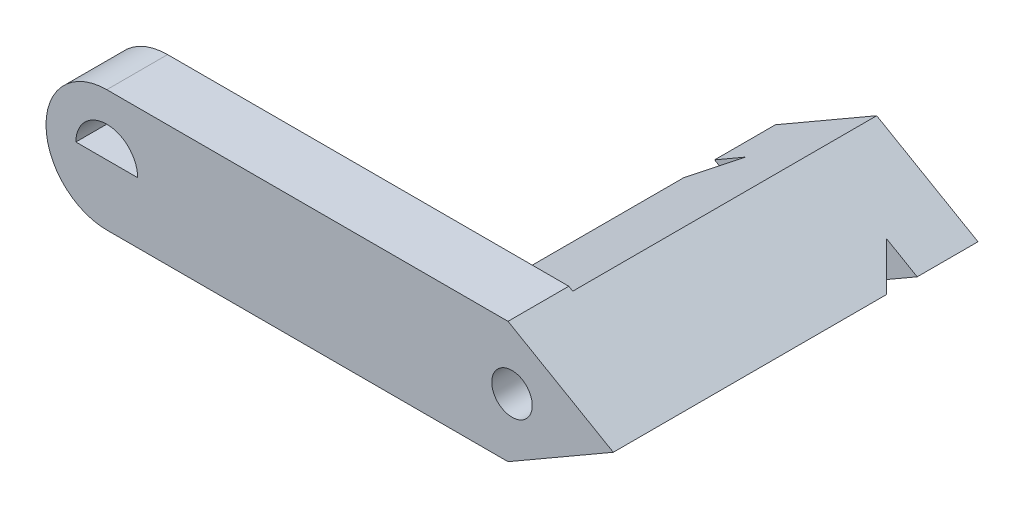
ISO-10303-21;
HEADER;
FILE_DESCRIPTION(('STEP AP214'),'2;1');
FILE_NAME('part.step','',(''),(''),'','','');
FILE_SCHEMA(('AUTOMOTIVE_DESIGN { 1 0 10303 214 1 1 1 1 }'));
ENDSEC;
DATA;
#1=APPLICATION_CONTEXT('core data for automotive mechanical design processes');
#2=APPLICATION_PROTOCOL_DEFINITION('international standard','automotive_design',2000,#1);
#3=PRODUCT_CONTEXT('',#1,'mechanical');
#4=PRODUCT('Part','Part','',(#3));
#5=PRODUCT_RELATED_PRODUCT_CATEGORY('part','',(#4));
#6=PRODUCT_DEFINITION_FORMATION('','',#4);
#7=PRODUCT_DEFINITION_CONTEXT('part definition',#1,'design');
#8=PRODUCT_DEFINITION('design','',#6,#7);
#9=PRODUCT_DEFINITION_SHAPE('','',#8);
#10=(LENGTH_UNIT() NAMED_UNIT(*) SI_UNIT(.MILLI.,.METRE.));
#11=(NAMED_UNIT(*) PLANE_ANGLE_UNIT() SI_UNIT($,.RADIAN.));
#12=(NAMED_UNIT(*) SI_UNIT($,.STERADIAN.) SOLID_ANGLE_UNIT());
#13=UNCERTAINTY_MEASURE_WITH_UNIT(LENGTH_MEASURE(1.E-05),#10,'distance_accuracy_value','');
#14=(GEOMETRIC_REPRESENTATION_CONTEXT(3) GLOBAL_UNCERTAINTY_ASSIGNED_CONTEXT((#13)) GLOBAL_UNIT_ASSIGNED_CONTEXT((#10,
#11,#12)) REPRESENTATION_CONTEXT('',''));
#15=CARTESIAN_POINT('',(0.,0.,0.));
#16=DIRECTION('',(0.,0.,1.));
#17=DIRECTION('',(1.,0.,0.));
#18=AXIS2_PLACEMENT_3D('',#15,#16,#17);
#19=CARTESIAN_POINT('',(0.,0.,-30.));
#20=DIRECTION('',(0.,0.,1.));
#21=DIRECTION('',(1.,0.,0.));
#22=AXIS2_PLACEMENT_3D('',#19,#20,#21);
#23=PLANE('',#22);
#24=DIRECTION('',(-0.866025403784441,0.499999999999997,0.));
#25=VECTOR('',#24,1.);
#26=CARTESIAN_POINT('',(14.6076951545865,0.,-30.));
#27=LINE('',#26,#25);
#28=CARTESIAN_POINT('',(14.9999999999999,-0.226497308103804,-30.));
#29=VERTEX_POINT('',#28);
#30=CARTESIAN_POINT('',(25.,-6.00000000000007,-30.));
#31=VERTEX_POINT('',#30);
#32=EDGE_CURVE('E318',#29,#31,#27,.F.);
#33=ORIENTED_EDGE('',*,*,#32,.T.);
#34=DIRECTION('',(0.866025403784441,0.499999999999997,0.));
#35=VECTOR('',#34,1.);
#36=CARTESIAN_POINT('',(25.,-5.99999999999992,-30.));
#37=LINE('',#36,#35);
#38=CARTESIAN_POINT('',(14.9999999999999,-11.7735026918962,-30.));
#39=VERTEX_POINT('',#38);
#40=EDGE_CURVE('E320',#31,#39,#37,.F.);
#41=ORIENTED_EDGE('',*,*,#40,.T.);
#42=DIRECTION('',(0.866025403784438,-0.500000000000001,0.));
#43=VECTOR('',#42,1.);
#44=CARTESIAN_POINT('',(5.,-5.99999999999998,-30.));
#45=LINE('',#44,#43);
#46=CARTESIAN_POINT('',(5.,-6.00000000000001,-30.));
#47=VERTEX_POINT('',#46);
#48=EDGE_CURVE('E296',#39,#47,#45,.F.);
#49=ORIENTED_EDGE('',*,*,#48,.T.);
#50=DIRECTION('',(-0.866025403784438,-0.500000000000001,0.));
#51=VECTOR('',#50,1.);
#52=CARTESIAN_POINT('',(15.3923048454133,0.,-30.));
#53=LINE('',#52,#51);
#54=EDGE_CURVE('E293',#47,#29,#53,.F.);
#55=ORIENTED_EDGE('',*,*,#54,.T.);
#56=EDGE_LOOP('',(#33,#41,#49,#55));
#57=FACE_BOUND('',#56,.T.);
#58=DIRECTION('',(-0.866025403784439,-0.499999999999999,0.));
#59=VECTOR('',#58,1.);
#60=CARTESIAN_POINT('',(15.,-1.84307806183469,-30.));
#61=LINE('',#60,#59);
#62=CARTESIAN_POINT('',(15.,-1.84307806183469,-30.));
#63=VERTEX_POINT('',#62);
#64=CARTESIAN_POINT('',(11.4,-3.92153903091735,-30.));
#65=VERTEX_POINT('',#64);
#66=EDGE_CURVE('E57',#63,#65,#61,.T.);
#67=ORIENTED_EDGE('',*,*,#66,.T.);
#68=DIRECTION('',(0.,-1.,0.));
#69=VECTOR('',#68,1.);
#70=CARTESIAN_POINT('',(11.4,-3.92153903091735,-30.));
#71=LINE('',#70,#69);
#72=CARTESIAN_POINT('',(11.4,-8.07846096908265,-30.));
#73=VERTEX_POINT('',#72);
#74=EDGE_CURVE('E217',#65,#73,#71,.T.);
#75=ORIENTED_EDGE('',*,*,#74,.T.);
#76=DIRECTION('',(0.866025403784439,-0.499999999999998,0.));
#77=VECTOR('',#76,1.);
#78=CARTESIAN_POINT('',(11.4,-8.07846096908265,-30.));
#79=LINE('',#78,#77);
#80=CARTESIAN_POINT('',(15.,-10.1569219381653,-30.));
#81=VERTEX_POINT('',#80);
#82=EDGE_CURVE('E599',#73,#81,#79,.T.);
#83=ORIENTED_EDGE('',*,*,#82,.T.);
#84=DIRECTION('',(0.866025403784438,0.500000000000001,0.));
#85=VECTOR('',#84,1.);
#86=CARTESIAN_POINT('',(15.,-10.1569219381653,-30.));
#87=LINE('',#86,#85);
#88=CARTESIAN_POINT('',(18.6,-8.07846096908265,-30.));
#89=VERTEX_POINT('',#88);
#90=EDGE_CURVE('E596',#81,#89,#87,.T.);
#91=ORIENTED_EDGE('',*,*,#90,.T.);
#92=DIRECTION('',(0.,1.,0.));
#93=VECTOR('',#92,1.);
#94=CARTESIAN_POINT('',(18.6,-8.07846096908265,-30.));
#95=LINE('',#94,#93);
#96=CARTESIAN_POINT('',(18.6,-3.92153903091734,-30.));
#97=VERTEX_POINT('',#96);
#98=EDGE_CURVE('E590',#89,#97,#95,.T.);
#99=ORIENTED_EDGE('',*,*,#98,.T.);
#100=DIRECTION('',(-0.866025403784439,0.5,0.));
#101=VECTOR('',#100,1.);
#102=CARTESIAN_POINT('',(18.6,-3.92153903091734,-30.));
#103=LINE('',#102,#101);
#104=EDGE_CURVE('E213',#97,#63,#103,.T.);
#105=ORIENTED_EDGE('',*,*,#104,.T.);
#106=EDGE_LOOP('',(#67,#75,#83,#91,#99,#105));
#107=FACE_BOUND('',#106,.T.);
#108=ADVANCED_FACE('F40',(#57,#107),#23,.F.);
#109=CARTESIAN_POINT('',(25.001,-7.75,-24.));
#110=DIRECTION('',(0.,-0.866025403784437,0.500000000000003));
#111=DIRECTION('',(0.,-0.500000000000003,-0.866025403784437));
#112=AXIS2_PLACEMENT_3D('',#109,#110,#111);
#113=PLANE('',#112);
#114=DIRECTION('',(-1.,0.,0.));
#115=VECTOR('',#114,1.);
#116=CARTESIAN_POINT('',(25.001,-7.75,-24.));
#117=LINE('',#116,#115);
#118=CARTESIAN_POINT('',(14.0317541634481,-7.75,-24.));
#119=VERTEX_POINT('',#118);
#120=CARTESIAN_POINT('',(8.03108891324555,-7.75,-24.));
#121=VERTEX_POINT('',#120);
#122=EDGE_CURVE('E241',#119,#121,#117,.T.);
#123=ORIENTED_EDGE('',*,*,#122,.T.);
#124=DIRECTION('',(0.654653670707979,-0.377964473009229,-0.654653670707974));
#125=VECTOR('',#124,1.);
#126=CARTESIAN_POINT('',(8.87046667710522,-8.23461497791616,-24.8393777638597));
#127=LINE('',#126,#125);
#128=CARTESIAN_POINT('',(5.,-6.,-20.9689110867545));
#129=VERTEX_POINT('',#128);
#130=EDGE_CURVE('E291',#121,#129,#127,.F.);
#131=ORIENTED_EDGE('',*,*,#130,.T.);
#132=DIRECTION('',(-1.,0.,0.));
#133=VECTOR('',#132,1.);
#134=CARTESIAN_POINT('',(25.001,-6.,-20.9689110867545));
#135=LINE('',#134,#133);
#136=CARTESIAN_POINT('',(13.,-6.,-20.9689110867545));
#137=VERTEX_POINT('',#136);
#138=EDGE_CURVE('E248',#137,#129,#135,.T.);
#139=ORIENTED_EDGE('',*,*,#138,.F.);
#140=CARTESIAN_POINT('',(15.,-6.,-20.9689110867545));
#141=DIRECTION('',(0.,-0.866025403784437,0.500000000000003));
#142=DIRECTION('',(0.,0.500000000000003,0.866025403784437));
#143=AXIS2_PLACEMENT_3D('',#140,#141,#142);
#144=ELLIPSE('',#143,3.99999999999998,2.);
#145=EDGE_CURVE('E233',#137,#119,#144,.T.);
#146=ORIENTED_EDGE('',*,*,#145,.T.);
#147=EDGE_LOOP('',(#123,#131,#139,#146));
#148=FACE_BOUND('',#147,.T.);
#149=ADVANCED_FACE('F413',(#148),#113,.F.);
#150=CARTESIAN_POINT('',(25.001,-4.25,-24.));
#151=DIRECTION('',(0.,0.,-1.));
#152=DIRECTION('',(-1.,0.,0.));
#153=AXIS2_PLACEMENT_3D('',#150,#151,#152);
#154=PLANE('',#153);
#155=CARTESIAN_POINT('',(21.9689110867543,-7.75,-24.));
#156=VERTEX_POINT('',#155);
#157=CARTESIAN_POINT('',(15.9682458365519,-7.75,-24.));
#158=VERTEX_POINT('',#157);
#159=EDGE_CURVE('E238',#156,#158,#117,.T.);
#160=ORIENTED_EDGE('',*,*,#159,.F.);
#161=DIRECTION('',(-0.866025403784441,-0.499999999999997,0.));
#162=VECTOR('',#161,1.);
#163=CARTESIAN_POINT('',(25.,-5.99999999999992,-24.));
#164=LINE('',#163,#162);
#165=CARTESIAN_POINT('',(25.,-6.00000000000007,-24.));
#166=VERTEX_POINT('',#165);
#167=EDGE_CURVE('E316',#156,#166,#164,.F.);
#168=ORIENTED_EDGE('',*,*,#167,.T.);
#169=DIRECTION('',(0.866025403784441,-0.499999999999997,0.));
#170=VECTOR('',#169,1.);
#171=CARTESIAN_POINT('',(14.6076951545865,0.,-24.));
#172=LINE('',#171,#170);
#173=CARTESIAN_POINT('',(21.9689110867543,-4.25,-24.));
#174=VERTEX_POINT('',#173);
#175=EDGE_CURVE('E314',#166,#174,#172,.F.);
#176=ORIENTED_EDGE('',*,*,#175,.T.);
#177=DIRECTION('',(-1.,0.,0.));
#178=VECTOR('',#177,1.);
#179=CARTESIAN_POINT('',(25.001,-4.25,-24.));
#180=LINE('',#179,#178);
#181=CARTESIAN_POINT('',(15.9682458365519,-4.25,-24.));
#182=VERTEX_POINT('',#181);
#183=EDGE_CURVE('E242',#174,#182,#180,.T.);
#184=ORIENTED_EDGE('',*,*,#183,.T.);
#185=CARTESIAN_POINT('',(15.,-6.,-24.));
#186=DIRECTION('',(0.,0.,-1.));
#187=DIRECTION('',(-1.,0.,0.));
#188=AXIS2_PLACEMENT_3D('',#185,#186,#187);
#189=CIRCLE('',#188,2.);
#190=EDGE_CURVE('E234',#182,#158,#189,.T.);
#191=ORIENTED_EDGE('',*,*,#190,.T.);
#192=EDGE_LOOP('',(#160,#168,#176,#184,#191));
#193=FACE_BOUND('',#192,.T.);
#194=ADVANCED_FACE('F394',(#193),#154,.F.);
#195=CARTESIAN_POINT('',(25.001,-6.,-20.9689110867545));
#196=DIRECTION('',(0.,0.866025403784437,0.500000000000003));
#197=DIRECTION('',(0.,-0.500000000000003,0.866025403784437));
#198=AXIS2_PLACEMENT_3D('',#195,#196,#197);
#199=PLANE('',#198);
#200=ORIENTED_EDGE('',*,*,#183,.F.);
#201=DIRECTION('',(-0.654653670707983,0.377964473009227,-0.654653670707971));
#202=VECTOR('',#201,1.);
#203=CARTESIAN_POINT('',(30.6196448398012,-9.24450346100937,-15.3492662469532));
#204=LINE('',#203,#202);
#205=CARTESIAN_POINT('',(25.,-6.,-20.9689110867545));
#206=VERTEX_POINT('',#205);
#207=EDGE_CURVE('E12',#174,#206,#204,.F.);
#208=ORIENTED_EDGE('',*,*,#207,.T.);
#209=CARTESIAN_POINT('',(17.,-6.,-20.9689110867545));
#210=VERTEX_POINT('',#209);
#211=EDGE_CURVE('E245',#206,#210,#135,.T.);
#212=ORIENTED_EDGE('',*,*,#211,.T.);
#213=CARTESIAN_POINT('',(15.,-6.,-20.9689110867545));
#214=DIRECTION('',(0.,0.866025403784437,0.500000000000003));
#215=DIRECTION('',(0.,-0.500000000000003,0.866025403784437));
#216=AXIS2_PLACEMENT_3D('',#213,#214,#215);
#217=ELLIPSE('',#216,3.99999999999998,2.);
#218=EDGE_CURVE('E285',#210,#182,#217,.T.);
#219=ORIENTED_EDGE('',*,*,#218,.T.);
#220=EDGE_LOOP('',(#200,#208,#212,#219));
#221=FACE_BOUND('',#220,.T.);
#222=ADVANCED_FACE('F420',(#221),#199,.F.);
#223=CARTESIAN_POINT('',(-25.,-6.,0.));
#224=DIRECTION('',(0.,0.,1.));
#225=DIRECTION('',(1.,0.,0.));
#226=AXIS2_PLACEMENT_3D('',#223,#224,#225);
#227=PLANE('',#226);
#228=DIRECTION('',(-1.,0.,0.));
#229=VECTOR('',#228,1.);
#230=CARTESIAN_POINT('',(-28.05,-6.,0.));
#231=LINE('',#230,#229);
#232=CARTESIAN_POINT('',(-21.95,-6.,0.));
#233=VERTEX_POINT('',#232);
#234=CARTESIAN_POINT('',(-28.05,-6.,0.));
#235=VERTEX_POINT('',#234);
#236=EDGE_CURVE('E258',#233,#235,#231,.T.);
#237=ORIENTED_EDGE('',*,*,#236,.F.);
#238=CARTESIAN_POINT('',(-25.,-6.,0.));
#239=DIRECTION('',(0.,0.,1.));
#240=DIRECTION('',(1.,0.,0.));
#241=AXIS2_PLACEMENT_3D('',#238,#239,#240);
#242=CIRCLE('',#241,3.05);
#243=EDGE_CURVE('E240',#235,#233,#242,.F.);
#244=ORIENTED_EDGE('',*,*,#243,.F.);
#245=EDGE_LOOP('',(#237,#244));
#246=FACE_BOUND('',#245,.T.);
#247=DIRECTION('',(-0.866025403784438,0.500000000000001,0.));
#248=VECTOR('',#247,1.);
#249=CARTESIAN_POINT('',(-17.5,6.99038105676661,0.));
#250=LINE('',#249,#248);
#251=CARTESIAN_POINT('',(5.,-5.99999999999998,0.));
#252=VERTEX_POINT('',#251);
#253=CARTESIAN_POINT('',(14.9999999999999,-11.7735026918962,0.));
#254=VERTEX_POINT('',#253);
#255=EDGE_CURVE('E300',#252,#254,#250,.F.);
#256=ORIENTED_EDGE('',*,*,#255,.T.);
#257=DIRECTION('',(0.866025403784441,0.499999999999997,0.));
#258=VECTOR('',#257,1.);
#259=CARTESIAN_POINT('',(25.,-5.99999999999992,0.));
#260=LINE('',#259,#258);
#261=CARTESIAN_POINT('',(14.6076951545865,-12.,0.));
#262=VERTEX_POINT('',#261);
#263=EDGE_CURVE('E326',#254,#262,#260,.F.);
#264=ORIENTED_EDGE('',*,*,#263,.T.);
#265=DIRECTION('',(1.,0.,0.));
#266=VECTOR('',#265,1.);
#267=CARTESIAN_POINT('',(-25.,-12.,0.));
#268=LINE('',#267,#266);
#269=CARTESIAN_POINT('',(-25.,-12.,0.));
#270=VERTEX_POINT('',#269);
#271=EDGE_CURVE('E267',#270,#262,#268,.T.);
#272=ORIENTED_EDGE('',*,*,#271,.F.);
#273=CARTESIAN_POINT('',(-25.,-6.,0.));
#274=DIRECTION('',(0.,0.,1.));
#275=DIRECTION('',(1.,0.,0.));
#276=AXIS2_PLACEMENT_3D('',#273,#274,#275);
#277=CIRCLE('',#276,6.);
#278=CARTESIAN_POINT('',(-25.,0.,0.));
#279=VERTEX_POINT('',#278);
#280=EDGE_CURVE('E273',#279,#270,#277,.T.);
#281=ORIENTED_EDGE('',*,*,#280,.F.);
#282=DIRECTION('',(-1.,0.,0.));
#283=VECTOR('',#282,1.);
#284=CARTESIAN_POINT('',(-25.,0.,0.));
#285=LINE('',#284,#283);
#286=CARTESIAN_POINT('',(14.6076951545865,0.,0.));
#287=VERTEX_POINT('',#286);
#288=EDGE_CURVE('E263',#287,#279,#285,.T.);
#289=ORIENTED_EDGE('',*,*,#288,.F.);
#290=DIRECTION('',(-0.866025403784441,0.499999999999997,0.));
#291=VECTOR('',#290,1.);
#292=CARTESIAN_POINT('',(14.6076951545865,0.,0.));
#293=LINE('',#292,#291);
#294=CARTESIAN_POINT('',(14.9999999999999,-0.226497308103805,0.));
#295=VERTEX_POINT('',#294);
#296=EDGE_CURVE('E324',#287,#295,#293,.F.);
#297=ORIENTED_EDGE('',*,*,#296,.T.);
#298=DIRECTION('',(0.866025403784438,0.500000000000001,0.));
#299=VECTOR('',#298,1.);
#300=CARTESIAN_POINT('',(-17.5,-18.9903810567666,0.));
#301=LINE('',#300,#299);
#302=EDGE_CURVE('E303',#295,#252,#301,.F.);
#303=ORIENTED_EDGE('',*,*,#302,.T.);
#304=EDGE_LOOP('',(#256,#264,#272,#281,#289,#297,#303));
#305=FACE_BOUND('',#304,.T.);
#306=ADVANCED_FACE('F368',(#246,#305),#227,.F.);
#307=CARTESIAN_POINT('',(-25.,0.,6.));
#308=DIRECTION('',(0.,-1.,0.));
#309=DIRECTION('',(0.,0.,-1.));
#310=AXIS2_PLACEMENT_3D('',#307,#308,#309);
#311=PLANE('',#310);
#312=DIRECTION('',(-1.,0.,0.));
#313=VECTOR('',#312,1.);
#314=CARTESIAN_POINT('',(0.,0.,6.));
#315=LINE('',#314,#313);
#316=CARTESIAN_POINT('',(14.6076951545865,0.,6.));
#317=VERTEX_POINT('',#316);
#318=CARTESIAN_POINT('',(-25.,0.,6.));
#319=VERTEX_POINT('',#318);
#320=EDGE_CURVE('E264',#317,#319,#315,.T.);
#321=ORIENTED_EDGE('',*,*,#320,.F.);
#322=DIRECTION('',(0.,0.,-1.));
#323=VECTOR('',#322,1.);
#324=CARTESIAN_POINT('',(14.6076951545865,0.,6.));
#325=LINE('',#324,#323);
#326=EDGE_CURVE('E334',#317,#287,#325,.T.);
#327=ORIENTED_EDGE('',*,*,#326,.T.);
#328=ORIENTED_EDGE('',*,*,#288,.T.);
#329=DIRECTION('',(0.,0.,-1.));
#330=VECTOR('',#329,1.);
#331=CARTESIAN_POINT('',(-25.,0.,6.));
#332=LINE('',#331,#330);
#333=EDGE_CURVE('E279',#319,#279,#332,.T.);
#334=ORIENTED_EDGE('',*,*,#333,.F.);
#335=EDGE_LOOP('',(#321,#327,#328,#334));
#336=FACE_BOUND('',#335,.T.);
#337=ADVANCED_FACE('F353',(#336),#311,.F.);
#338=CARTESIAN_POINT('',(-25.,-6.,6.));
#339=DIRECTION('',(0.,0.,-1.));
#340=DIRECTION('',(-1.,0.,0.));
#341=AXIS2_PLACEMENT_3D('',#338,#339,#340);
#342=CYLINDRICAL_SURFACE('',#341,6.);
#343=ORIENTED_EDGE('',*,*,#280,.T.);
#344=DIRECTION('',(0.,0.,-1.));
#345=VECTOR('',#344,1.);
#346=CARTESIAN_POINT('',(-25.,-12.,6.));
#347=LINE('',#346,#345);
#348=CARTESIAN_POINT('',(-25.,-12.,6.));
#349=VERTEX_POINT('',#348);
#350=EDGE_CURVE('E271',#349,#270,#347,.T.);
#351=ORIENTED_EDGE('',*,*,#350,.F.);
#352=CARTESIAN_POINT('',(-25.,-6.,6.));
#353=DIRECTION('',(0.,0.,1.));
#354=DIRECTION('',(1.,0.,0.));
#355=AXIS2_PLACEMENT_3D('',#352,#353,#354);
#356=CIRCLE('',#355,6.);
#357=EDGE_CURVE('E266',#319,#349,#356,.T.);
#358=ORIENTED_EDGE('',*,*,#357,.F.);
#359=ORIENTED_EDGE('',*,*,#333,.T.);
#360=EDGE_LOOP('',(#343,#351,#358,#359));
#361=FACE_BOUND('',#360,.T.);
#362=ADVANCED_FACE('F359',(#361),#342,.T.);
#363=CARTESIAN_POINT('',(-25.,-12.,6.));
#364=DIRECTION('',(0.,1.,0.));
#365=DIRECTION('',(0.,0.,1.));
#366=AXIS2_PLACEMENT_3D('',#363,#364,#365);
#367=PLANE('',#366);
#368=ORIENTED_EDGE('',*,*,#271,.T.);
#369=DIRECTION('',(0.,0.,1.));
#370=VECTOR('',#369,1.);
#371=CARTESIAN_POINT('',(14.6076951545865,-12.,6.));
#372=LINE('',#371,#370);
#373=CARTESIAN_POINT('',(14.6076951545865,-12.,6.));
#374=VERTEX_POINT('',#373);
#375=EDGE_CURVE('E328',#262,#374,#372,.T.);
#376=ORIENTED_EDGE('',*,*,#375,.T.);
#377=DIRECTION('',(1.,0.,0.));
#378=VECTOR('',#377,1.);
#379=CARTESIAN_POINT('',(-25.,-12.,6.));
#380=LINE('',#379,#378);
#381=EDGE_CURVE('E269',#349,#374,#380,.T.);
#382=ORIENTED_EDGE('',*,*,#381,.F.);
#383=ORIENTED_EDGE('',*,*,#350,.T.);
#384=EDGE_LOOP('',(#368,#376,#382,#383));
#385=FACE_BOUND('',#384,.T.);
#386=ADVANCED_FACE('F362',(#385),#367,.F.);
#387=CARTESIAN_POINT('',(-25.,-6.,6.));
#388=DIRECTION('',(0.,0.,1.));
#389=DIRECTION('',(1.,0.,0.));
#390=AXIS2_PLACEMENT_3D('',#387,#388,#389);
#391=PLANE('',#390);
#392=CARTESIAN_POINT('',(15.,-6.,6.));
#393=DIRECTION('',(0.,0.,1.));
#394=DIRECTION('',(1.,0.,0.));
#395=AXIS2_PLACEMENT_3D('',#392,#393,#394);
#396=CIRCLE('',#395,2.);
#397=CARTESIAN_POINT('',(17.,-6.,6.));
#398=VERTEX_POINT('',#397);
#399=EDGE_CURVE('E226',#398,#398,#396,.T.);
#400=ORIENTED_EDGE('',*,*,#399,.F.);
#401=EDGE_LOOP('',(#400));
#402=FACE_BOUND('',#401,.T.);
#403=CARTESIAN_POINT('',(-25.,-6.,6.));
#404=DIRECTION('',(0.,0.,1.));
#405=DIRECTION('',(1.,0.,0.));
#406=AXIS2_PLACEMENT_3D('',#403,#404,#405);
#407=CIRCLE('',#406,3.05);
#408=CARTESIAN_POINT('',(-21.95,-6.,6.));
#409=VERTEX_POINT('',#408);
#410=CARTESIAN_POINT('',(-28.05,-6.,6.));
#411=VERTEX_POINT('',#410);
#412=EDGE_CURVE('E250',#409,#411,#407,.T.);
#413=ORIENTED_EDGE('',*,*,#412,.F.);
#414=DIRECTION('',(1.,0.,0.));
#415=VECTOR('',#414,1.);
#416=CARTESIAN_POINT('',(-28.05,-6.,6.));
#417=LINE('',#416,#415);
#418=EDGE_CURVE('E252',#411,#409,#417,.T.);
#419=ORIENTED_EDGE('',*,*,#418,.F.);
#420=EDGE_LOOP('',(#413,#419));
#421=FACE_BOUND('',#420,.T.);
#422=ORIENTED_EDGE('',*,*,#381,.T.);
#423=DIRECTION('',(-0.866025403784441,-0.499999999999997,0.));
#424=VECTOR('',#423,1.);
#425=CARTESIAN_POINT('',(-12.5000000000002,-27.6506350946108,6.));
#426=LINE('',#425,#424);
#427=CARTESIAN_POINT('',(25.,-6.00000000000007,6.));
#428=VERTEX_POINT('',#427);
#429=EDGE_CURVE('E65',#374,#428,#426,.F.);
#430=ORIENTED_EDGE('',*,*,#429,.T.);
#431=DIRECTION('',(0.866025403784441,-0.499999999999997,0.));
#432=VECTOR('',#431,1.);
#433=CARTESIAN_POINT('',(-12.5000000000002,15.6506350946108,6.));
#434=LINE('',#433,#432);
#435=EDGE_CURVE('E331',#428,#317,#434,.F.);
#436=ORIENTED_EDGE('',*,*,#435,.T.);
#437=ORIENTED_EDGE('',*,*,#320,.T.);
#438=ORIENTED_EDGE('',*,*,#357,.T.);
#439=EDGE_LOOP('',(#422,#430,#436,#437,#438));
#440=FACE_BOUND('',#439,.T.);
#441=ADVANCED_FACE('F350',(#402,#421,#440),#391,.T.);
#442=CARTESIAN_POINT('',(-25.,-6.,-0.00100000000000013));
#443=DIRECTION('',(0.,0.,1.));
#444=DIRECTION('',(1.,0.,0.));
#445=AXIS2_PLACEMENT_3D('',#442,#443,#444);
#446=CYLINDRICAL_SURFACE('',#445,3.05);
#447=ORIENTED_EDGE('',*,*,#243,.T.);
#448=DIRECTION('',(0.,0.,1.));
#449=VECTOR('',#448,1.);
#450=CARTESIAN_POINT('',(-21.95,-6.,-0.00100000000000013));
#451=LINE('',#450,#449);
#452=EDGE_CURVE('E256',#233,#409,#451,.T.);
#453=ORIENTED_EDGE('',*,*,#452,.T.);
#454=ORIENTED_EDGE('',*,*,#412,.T.);
#455=DIRECTION('',(0.,0.,1.));
#456=VECTOR('',#455,1.);
#457=CARTESIAN_POINT('',(-28.05,-6.,-0.00100000000000013));
#458=LINE('',#457,#456);
#459=EDGE_CURVE('E255',#235,#411,#458,.T.);
#460=ORIENTED_EDGE('',*,*,#459,.F.);
#461=EDGE_LOOP('',(#447,#453,#454,#460));
#462=FACE_BOUND('',#461,.T.);
#463=ADVANCED_FACE('F430',(#462),#446,.F.);
#464=CARTESIAN_POINT('',(-28.05,-6.,-0.00100000000000013));
#465=DIRECTION('',(0.,-1.,0.));
#466=DIRECTION('',(0.,0.,-1.));
#467=AXIS2_PLACEMENT_3D('',#464,#465,#466);
#468=PLANE('',#467);
#469=ORIENTED_EDGE('',*,*,#236,.T.);
#470=ORIENTED_EDGE('',*,*,#459,.T.);
#471=ORIENTED_EDGE('',*,*,#418,.T.);
#472=ORIENTED_EDGE('',*,*,#452,.F.);
#473=EDGE_LOOP('',(#469,#470,#471,#472));
#474=FACE_BOUND('',#473,.T.);
#475=ADVANCED_FACE('F425',(#474),#468,.F.);
#476=ORIENTED_EDGE('',*,*,#211,.F.);
#477=DIRECTION('',(0.654653670707983,0.377964473009227,0.654653670707971));
#478=VECTOR('',#477,1.);
#479=CARTESIAN_POINT('',(36.5581047514662,0.673074889580893,-9.41080633528842));
#480=LINE('',#479,#478);
#481=EDGE_CURVE('E305',#206,#156,#480,.F.);
#482=ORIENTED_EDGE('',*,*,#481,.T.);
#483=ORIENTED_EDGE('',*,*,#159,.T.);
#484=EDGE_CURVE('E237',#158,#210,#144,.T.);
#485=ORIENTED_EDGE('',*,*,#484,.T.);
#486=EDGE_LOOP('',(#476,#482,#483,#485));
#487=FACE_BOUND('',#486,.T.);
#488=ADVANCED_FACE('F390',(#487),#113,.F.);
#489=DIRECTION('',(0.866025403784438,0.500000000000001,0.));
#490=VECTOR('',#489,1.);
#491=CARTESIAN_POINT('',(15.3923048454133,0.,-24.));
#492=LINE('',#491,#490);
#493=CARTESIAN_POINT('',(8.03108891324554,-4.25,-24.));
#494=VERTEX_POINT('',#493);
#495=CARTESIAN_POINT('',(5.,-6.00000000000001,-24.));
#496=VERTEX_POINT('',#495);
#497=EDGE_CURVE('E286',#494,#496,#492,.F.);
#498=ORIENTED_EDGE('',*,*,#497,.T.);
#499=DIRECTION('',(-0.866025403784438,0.500000000000001,0.));
#500=VECTOR('',#499,1.);
#501=CARTESIAN_POINT('',(5.,-5.99999999999998,-24.));
#502=LINE('',#501,#500);
#503=EDGE_CURVE('E288',#496,#121,#502,.F.);
#504=ORIENTED_EDGE('',*,*,#503,.T.);
#505=ORIENTED_EDGE('',*,*,#122,.F.);
#506=CARTESIAN_POINT('',(14.0317541634481,-4.25,-24.));
#507=VERTEX_POINT('',#506);
#508=EDGE_CURVE('E229',#119,#507,#189,.T.);
#509=ORIENTED_EDGE('',*,*,#508,.T.);
#510=EDGE_CURVE('E244',#507,#494,#180,.T.);
#511=ORIENTED_EDGE('',*,*,#510,.T.);
#512=EDGE_LOOP('',(#498,#504,#505,#509,#511));
#513=FACE_BOUND('',#512,.T.);
#514=ADVANCED_FACE('F408',(#513),#154,.F.);
#515=ORIENTED_EDGE('',*,*,#138,.T.);
#516=DIRECTION('',(-0.654653670707979,-0.377964473009229,0.654653670707974));
#517=VECTOR('',#516,1.);
#518=CARTESIAN_POINT('',(-0.619644839801432,-9.24450346100946,-15.3492662469531));
#519=LINE('',#518,#517);
#520=EDGE_CURVE('E298',#129,#494,#519,.F.);
#521=ORIENTED_EDGE('',*,*,#520,.T.);
#522=ORIENTED_EDGE('',*,*,#510,.F.);
#523=EDGE_CURVE('E282',#507,#137,#217,.T.);
#524=ORIENTED_EDGE('',*,*,#523,.T.);
#525=EDGE_LOOP('',(#515,#521,#522,#524));
#526=FACE_BOUND('',#525,.T.);
#527=ADVANCED_FACE('F403',(#526),#199,.F.);
#528=CARTESIAN_POINT('',(15.,-6.,-30.));
#529=DIRECTION('',(0.,0.,1.));
#530=DIRECTION('',(1.,0.,0.));
#531=AXIS2_PLACEMENT_3D('',#528,#529,#530);
#532=CYLINDRICAL_SURFACE('',#531,2.);
#533=CARTESIAN_POINT('',(15.,-6.,-26.));
#534=DIRECTION('',(0.,0.,1.));
#535=DIRECTION('',(1.,0.,0.));
#536=AXIS2_PLACEMENT_3D('',#533,#534,#535);
#537=CIRCLE('',#536,2.);
#538=CARTESIAN_POINT('',(17.,-6.,-26.));
#539=VERTEX_POINT('',#538);
#540=EDGE_CURVE('E44',#539,#539,#537,.F.);
#541=ORIENTED_EDGE('',*,*,#540,.T.);
#542=EDGE_LOOP('',(#541));
#543=FACE_BOUND('',#542,.T.);
#544=ORIENTED_EDGE('',*,*,#399,.T.);
#545=EDGE_LOOP('',(#544));
#546=FACE_BOUND('',#545,.T.);
#547=ORIENTED_EDGE('',*,*,#523,.F.);
#548=ORIENTED_EDGE('',*,*,#508,.F.);
#549=ORIENTED_EDGE('',*,*,#145,.F.);
#550=EDGE_LOOP('',(#547,#548,#549));
#551=FACE_BOUND('',#550,.T.);
#552=ORIENTED_EDGE('',*,*,#190,.F.);
#553=ORIENTED_EDGE('',*,*,#218,.F.);
#554=ORIENTED_EDGE('',*,*,#484,.F.);
#555=EDGE_LOOP('',(#552,#553,#554));
#556=FACE_BOUND('',#555,.T.);
#557=ADVANCED_FACE('F412',(#543,#546,#551,#556),#532,.F.);
#558=CARTESIAN_POINT('',(15.3923048454133,0.,6.));
#559=DIRECTION('',(0.500000000000001,-0.866025403784438,0.));
#560=DIRECTION('',(0.,0.,1.));
#561=AXIS2_PLACEMENT_3D('',#558,#559,#560);
#562=PLANE('',#561);
#563=ORIENTED_EDGE('',*,*,#302,.F.);
#564=DIRECTION('',(0.,0.,-1.));
#565=VECTOR('',#564,1.);
#566=CARTESIAN_POINT('',(14.9999999999999,-0.226497308103803,6.));
#567=LINE('',#566,#565);
#568=EDGE_CURVE('E49',#295,#29,#567,.T.);
#569=ORIENTED_EDGE('',*,*,#568,.T.);
#570=ORIENTED_EDGE('',*,*,#54,.F.);
#571=DIRECTION('',(0.,0.,-1.));
#572=VECTOR('',#571,1.);
#573=CARTESIAN_POINT('',(5.,-6.00000000000001,-30.));
#574=LINE('',#573,#572);
#575=EDGE_CURVE('E230',#496,#47,#574,.T.);
#576=ORIENTED_EDGE('',*,*,#575,.F.);
#577=ORIENTED_EDGE('',*,*,#497,.F.);
#578=ORIENTED_EDGE('',*,*,#520,.F.);
#579=DIRECTION('',(0.,0.,-1.));
#580=VECTOR('',#579,1.);
#581=CARTESIAN_POINT('',(5.,-6.00000000000001,-30.));
#582=LINE('',#581,#580);
#583=EDGE_CURVE('E306',#252,#129,#582,.T.);
#584=ORIENTED_EDGE('',*,*,#583,.F.);
#585=EDGE_LOOP('',(#563,#569,#570,#576,#577,#578,#584));
#586=FACE_BOUND('',#585,.T.);
#587=ADVANCED_FACE('F382',(#586),#562,.F.);
#588=CARTESIAN_POINT('',(5.,-5.99999999999998,-30.));
#589=DIRECTION('',(0.500000000000001,0.866025403784438,0.));
#590=DIRECTION('',(0.,0.,1.));
#591=AXIS2_PLACEMENT_3D('',#588,#589,#590);
#592=PLANE('',#591);
#593=ORIENTED_EDGE('',*,*,#48,.F.);
#594=DIRECTION('',(0.,0.,1.));
#595=VECTOR('',#594,1.);
#596=CARTESIAN_POINT('',(14.9999999999999,-11.7735026918962,-30.));
#597=LINE('',#596,#595);
#598=EDGE_CURVE('E322',#39,#254,#597,.T.);
#599=ORIENTED_EDGE('',*,*,#598,.T.);
#600=ORIENTED_EDGE('',*,*,#255,.F.);
#601=ORIENTED_EDGE('',*,*,#583,.T.);
#602=ORIENTED_EDGE('',*,*,#130,.F.);
#603=ORIENTED_EDGE('',*,*,#503,.F.);
#604=ORIENTED_EDGE('',*,*,#575,.T.);
#605=EDGE_LOOP('',(#593,#599,#600,#601,#602,#603,#604));
#606=FACE_BOUND('',#605,.T.);
#607=ADVANCED_FACE('F374',(#606),#592,.F.);
#608=CARTESIAN_POINT('',(14.6076951545865,0.,6.));
#609=DIRECTION('',(-0.499999999999997,-0.866025403784441,0.));
#610=DIRECTION('',(0.,0.,-1.));
#611=AXIS2_PLACEMENT_3D('',#608,#609,#610);
#612=PLANE('',#611);
#613=ORIENTED_EDGE('',*,*,#326,.F.);
#614=ORIENTED_EDGE('',*,*,#435,.F.);
#615=DIRECTION('',(0.,0.,1.));
#616=VECTOR('',#615,1.);
#617=CARTESIAN_POINT('',(25.,-6.00000000000007,6.));
#618=LINE('',#617,#616);
#619=EDGE_CURVE('E309',#206,#428,#618,.T.);
#620=ORIENTED_EDGE('',*,*,#619,.F.);
#621=ORIENTED_EDGE('',*,*,#207,.F.);
#622=ORIENTED_EDGE('',*,*,#175,.F.);
#623=DIRECTION('',(0.,0.,1.));
#624=VECTOR('',#623,1.);
#625=CARTESIAN_POINT('',(25.,-6.00000000000007,6.));
#626=LINE('',#625,#624);
#627=EDGE_CURVE('E221',#31,#166,#626,.T.);
#628=ORIENTED_EDGE('',*,*,#627,.F.);
#629=ORIENTED_EDGE('',*,*,#32,.F.);
#630=ORIENTED_EDGE('',*,*,#568,.F.);
#631=ORIENTED_EDGE('',*,*,#296,.F.);
#632=EDGE_LOOP('',(#613,#614,#620,#621,#622,#628,#629,#630,#631));
#633=FACE_BOUND('',#632,.T.);
#634=ADVANCED_FACE('F42',(#633),#612,.F.);
#635=CARTESIAN_POINT('',(25.,-5.99999999999992,6.));
#636=DIRECTION('',(-0.499999999999997,0.866025403784441,0.));
#637=DIRECTION('',(0.,0.,-1.));
#638=AXIS2_PLACEMENT_3D('',#635,#636,#637);
#639=PLANE('',#638);
#640=ORIENTED_EDGE('',*,*,#429,.F.);
#641=ORIENTED_EDGE('',*,*,#375,.F.);
#642=ORIENTED_EDGE('',*,*,#263,.F.);
#643=ORIENTED_EDGE('',*,*,#598,.F.);
#644=ORIENTED_EDGE('',*,*,#40,.F.);
#645=ORIENTED_EDGE('',*,*,#627,.T.);
#646=ORIENTED_EDGE('',*,*,#167,.F.);
#647=ORIENTED_EDGE('',*,*,#481,.F.);
#648=ORIENTED_EDGE('',*,*,#619,.T.);
#649=EDGE_LOOP('',(#640,#641,#642,#643,#644,#645,#646,#647,#648));
#650=FACE_BOUND('',#649,.T.);
#651=ADVANCED_FACE('F342',(#650),#639,.F.);
#652=CARTESIAN_POINT('',(0.,0.,-26.));
#653=DIRECTION('',(0.,0.,1.));
#654=DIRECTION('',(1.,0.,0.));
#655=AXIS2_PLACEMENT_3D('',#652,#653,#654);
#656=PLANE('',#655);
#657=DIRECTION('',(-0.866025403784439,-0.499999999999999,0.));
#658=VECTOR('',#657,1.);
#659=CARTESIAN_POINT('',(15.,-1.84307806183469,-26.));
#660=LINE('',#659,#658);
#661=CARTESIAN_POINT('',(15.,-1.84307806183469,-26.));
#662=VERTEX_POINT('',#661);
#663=CARTESIAN_POINT('',(11.4,-3.92153903091735,-26.));
#664=VERTEX_POINT('',#663);
#665=EDGE_CURVE('E203',#662,#664,#660,.T.);
#666=ORIENTED_EDGE('',*,*,#665,.F.);
#667=DIRECTION('',(-0.866025403784439,0.5,0.));
#668=VECTOR('',#667,1.);
#669=CARTESIAN_POINT('',(18.6,-3.92153903091734,-26.));
#670=LINE('',#669,#668);
#671=CARTESIAN_POINT('',(18.6,-3.92153903091734,-26.));
#672=VERTEX_POINT('',#671);
#673=EDGE_CURVE('E604',#672,#662,#670,.T.);
#674=ORIENTED_EDGE('',*,*,#673,.F.);
#675=DIRECTION('',(0.,1.,0.));
#676=VECTOR('',#675,1.);
#677=CARTESIAN_POINT('',(18.6,-8.07846096908265,-26.));
#678=LINE('',#677,#676);
#679=CARTESIAN_POINT('',(18.6,-8.07846096908265,-26.));
#680=VERTEX_POINT('',#679);
#681=EDGE_CURVE('E613',#680,#672,#678,.T.);
#682=ORIENTED_EDGE('',*,*,#681,.F.);
#683=DIRECTION('',(0.866025403784438,0.500000000000001,0.));
#684=VECTOR('',#683,1.);
#685=CARTESIAN_POINT('',(15.,-10.1569219381653,-26.));
#686=LINE('',#685,#684);
#687=CARTESIAN_POINT('',(15.,-10.1569219381653,-26.));
#688=VERTEX_POINT('',#687);
#689=EDGE_CURVE('E615',#688,#680,#686,.T.);
#690=ORIENTED_EDGE('',*,*,#689,.F.);
#691=DIRECTION('',(0.866025403784439,-0.499999999999998,0.));
#692=VECTOR('',#691,1.);
#693=CARTESIAN_POINT('',(11.4,-8.07846096908265,-26.));
#694=LINE('',#693,#692);
#695=CARTESIAN_POINT('',(11.4,-8.07846096908265,-26.));
#696=VERTEX_POINT('',#695);
#697=EDGE_CURVE('E205',#696,#688,#694,.T.);
#698=ORIENTED_EDGE('',*,*,#697,.F.);
#699=DIRECTION('',(0.,-1.,0.));
#700=VECTOR('',#699,1.);
#701=CARTESIAN_POINT('',(11.4,-3.92153903091735,-26.));
#702=LINE('',#701,#700);
#703=EDGE_CURVE('E198',#664,#696,#702,.T.);
#704=ORIENTED_EDGE('',*,*,#703,.F.);
#705=EDGE_LOOP('',(#666,#674,#682,#690,#698,#704));
#706=FACE_BOUND('',#705,.T.);
#707=ORIENTED_EDGE('',*,*,#540,.F.);
#708=EDGE_LOOP('',(#707));
#709=FACE_BOUND('',#708,.T.);
#710=ADVANCED_FACE('F200',(#706,#709),#656,.F.);
#711=CARTESIAN_POINT('',(15.,-1.84307806183469,-26.));
#712=DIRECTION('',(0.5,-0.866025403784439,0.));
#713=DIRECTION('',(0.866025403784439,0.499999999999999,0.));
#714=AXIS2_PLACEMENT_3D('',#711,#712,#713);
#715=PLANE('',#714);
#716=ORIENTED_EDGE('',*,*,#66,.F.);
#717=DIRECTION('',(0.,0.,-1.));
#718=VECTOR('',#717,1.);
#719=CARTESIAN_POINT('',(15.,-1.84307806183469,-26.));
#720=LINE('',#719,#718);
#721=EDGE_CURVE('E212',#662,#63,#720,.T.);
#722=ORIENTED_EDGE('',*,*,#721,.F.);
#723=ORIENTED_EDGE('',*,*,#665,.T.);
#724=DIRECTION('',(0.,0.,-1.));
#725=VECTOR('',#724,1.);
#726=CARTESIAN_POINT('',(11.4,-3.92153903091735,-26.));
#727=LINE('',#726,#725);
#728=EDGE_CURVE('E211',#664,#65,#727,.T.);
#729=ORIENTED_EDGE('',*,*,#728,.T.);
#730=EDGE_LOOP('',(#716,#722,#723,#729));
#731=FACE_BOUND('',#730,.T.);
#732=ADVANCED_FACE('F210',(#731),#715,.T.);
#733=CARTESIAN_POINT('',(11.4,-3.92153903091735,-26.));
#734=DIRECTION('',(1.,0.,0.));
#735=DIRECTION('',(0.,0.,-1.));
#736=AXIS2_PLACEMENT_3D('',#733,#734,#735);
#737=PLANE('',#736);
#738=ORIENTED_EDGE('',*,*,#74,.F.);
#739=ORIENTED_EDGE('',*,*,#728,.F.);
#740=ORIENTED_EDGE('',*,*,#703,.T.);
#741=DIRECTION('',(0.,0.,-1.));
#742=VECTOR('',#741,1.);
#743=CARTESIAN_POINT('',(11.4,-8.07846096908265,-26.));
#744=LINE('',#743,#742);
#745=EDGE_CURVE('E218',#696,#73,#744,.T.);
#746=ORIENTED_EDGE('',*,*,#745,.T.);
#747=EDGE_LOOP('',(#738,#739,#740,#746));
#748=FACE_BOUND('',#747,.T.);
#749=ADVANCED_FACE('F215',(#748),#737,.T.);
#750=CARTESIAN_POINT('',(11.4,-8.07846096908265,-26.));
#751=DIRECTION('',(0.499999999999999,0.866025403784439,0.));
#752=DIRECTION('',(-0.866025403784439,0.499999999999999,0.));
#753=AXIS2_PLACEMENT_3D('',#750,#751,#752);
#754=PLANE('',#753);
#755=ORIENTED_EDGE('',*,*,#82,.F.);
#756=ORIENTED_EDGE('',*,*,#745,.F.);
#757=ORIENTED_EDGE('',*,*,#697,.T.);
#758=DIRECTION('',(0.,0.,-1.));
#759=VECTOR('',#758,1.);
#760=CARTESIAN_POINT('',(15.,-10.1569219381653,-26.));
#761=LINE('',#760,#759);
#762=EDGE_CURVE('E222',#688,#81,#761,.T.);
#763=ORIENTED_EDGE('',*,*,#762,.T.);
#764=EDGE_LOOP('',(#755,#756,#757,#763));
#765=FACE_BOUND('',#764,.T.);
#766=ADVANCED_FACE('F568',(#765),#754,.T.);
#767=CARTESIAN_POINT('',(15.,-10.1569219381653,-26.));
#768=DIRECTION('',(-0.500000000000001,0.866025403784438,0.));
#769=DIRECTION('',(-0.866025403784438,-0.500000000000001,0.));
#770=AXIS2_PLACEMENT_3D('',#767,#768,#769);
#771=PLANE('',#770);
#772=ORIENTED_EDGE('',*,*,#90,.F.);
#773=ORIENTED_EDGE('',*,*,#762,.F.);
#774=ORIENTED_EDGE('',*,*,#689,.T.);
#775=DIRECTION('',(0.,0.,-1.));
#776=VECTOR('',#775,1.);
#777=CARTESIAN_POINT('',(18.6,-8.07846096908265,-26.));
#778=LINE('',#777,#776);
#779=EDGE_CURVE('E606',#680,#89,#778,.T.);
#780=ORIENTED_EDGE('',*,*,#779,.T.);
#781=EDGE_LOOP('',(#772,#773,#774,#780));
#782=FACE_BOUND('',#781,.T.);
#783=ADVANCED_FACE('F571',(#782),#771,.T.);
#784=CARTESIAN_POINT('',(18.6,-8.07846096908265,-26.));
#785=DIRECTION('',(-1.,0.,0.));
#786=DIRECTION('',(0.,0.,1.));
#787=AXIS2_PLACEMENT_3D('',#784,#785,#786);
#788=PLANE('',#787);
#789=ORIENTED_EDGE('',*,*,#98,.F.);
#790=ORIENTED_EDGE('',*,*,#779,.F.);
#791=ORIENTED_EDGE('',*,*,#681,.T.);
#792=DIRECTION('',(0.,0.,-1.));
#793=VECTOR('',#792,1.);
#794=CARTESIAN_POINT('',(18.6,-3.92153903091734,-26.));
#795=LINE('',#794,#793);
#796=EDGE_CURVE('E589',#672,#97,#795,.T.);
#797=ORIENTED_EDGE('',*,*,#796,.T.);
#798=EDGE_LOOP('',(#789,#790,#791,#797));
#799=FACE_BOUND('',#798,.T.);
#800=ADVANCED_FACE('F575',(#799),#788,.T.);
#801=CARTESIAN_POINT('',(18.6,-3.92153903091734,-26.));
#802=DIRECTION('',(-0.5,-0.866025403784439,0.));
#803=DIRECTION('',(0.866025403784439,-0.5,0.));
#804=AXIS2_PLACEMENT_3D('',#801,#802,#803);
#805=PLANE('',#804);
#806=ORIENTED_EDGE('',*,*,#104,.F.);
#807=ORIENTED_EDGE('',*,*,#796,.F.);
#808=ORIENTED_EDGE('',*,*,#673,.T.);
#809=ORIENTED_EDGE('',*,*,#721,.T.);
#810=EDGE_LOOP('',(#806,#807,#808,#809));
#811=FACE_BOUND('',#810,.T.);
#812=ADVANCED_FACE('F579',(#811),#805,.T.);
#813=CLOSED_SHELL('',(#108,#149,#194,#222,#306,#337,#362,#386,#441,#463,#475,#488,#514,#527,
#557,#587,#607,#634,#651,#710,#732,#749,#766,#783,#800,#812));
#814=MANIFOLD_SOLID_BREP('B2',#813);
#815=ADVANCED_BREP_SHAPE_REPRESENTATION('',(#18,#814),#14);
#816=SHAPE_DEFINITION_REPRESENTATION(#9,#815);
ENDSEC;
END-ISO-10303-21;
